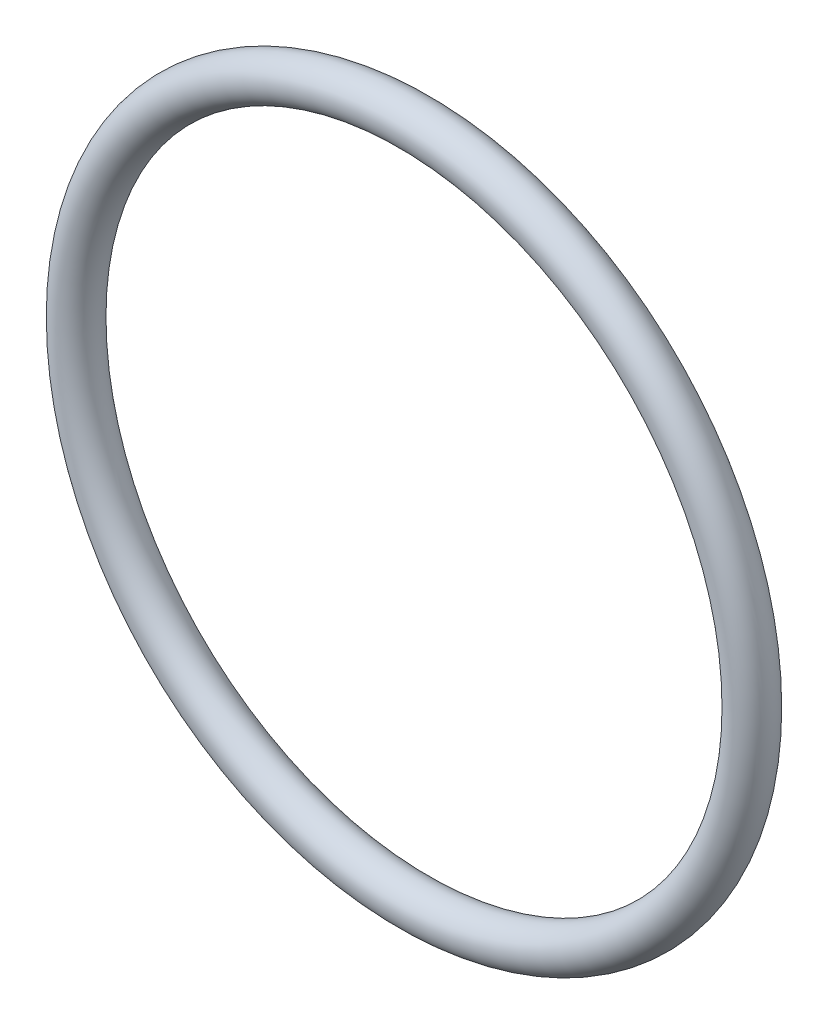
ISO-10303-21;
HEADER;
FILE_DESCRIPTION(('STEP AP214'),'2;1');
FILE_NAME('part.step','',(''),(''),'','','');
FILE_SCHEMA(('AUTOMOTIVE_DESIGN { 1 0 10303 214 1 1 1 1 }'));
ENDSEC;
DATA;
#1=APPLICATION_CONTEXT('core data for automotive mechanical design processes');
#2=APPLICATION_PROTOCOL_DEFINITION('international standard','automotive_design',2000,#1);
#3=PRODUCT_CONTEXT('',#1,'mechanical');
#4=PRODUCT('Part','Part','',(#3));
#5=PRODUCT_RELATED_PRODUCT_CATEGORY('part','',(#4));
#6=PRODUCT_DEFINITION_FORMATION('','',#4);
#7=PRODUCT_DEFINITION_CONTEXT('part definition',#1,'design');
#8=PRODUCT_DEFINITION('design','',#6,#7);
#9=PRODUCT_DEFINITION_SHAPE('','',#8);
#10=(LENGTH_UNIT() NAMED_UNIT(*) SI_UNIT(.MILLI.,.METRE.));
#11=(NAMED_UNIT(*) PLANE_ANGLE_UNIT() SI_UNIT($,.RADIAN.));
#12=(NAMED_UNIT(*) SI_UNIT($,.STERADIAN.) SOLID_ANGLE_UNIT());
#13=UNCERTAINTY_MEASURE_WITH_UNIT(LENGTH_MEASURE(1.E-05),#10,'distance_accuracy_value','');
#14=(GEOMETRIC_REPRESENTATION_CONTEXT(3) GLOBAL_UNCERTAINTY_ASSIGNED_CONTEXT((#13)) GLOBAL_UNIT_ASSIGNED_CONTEXT((#10,
#11,#12)) REPRESENTATION_CONTEXT('',''));
#15=CARTESIAN_POINT('',(0.,0.,0.));
#16=DIRECTION('',(0.,0.,1.));
#17=DIRECTION('',(1.,0.,0.));
#18=AXIS2_PLACEMENT_3D('',#15,#16,#17);
#19=CARTESIAN_POINT('',(0.,0.,0.));
#20=DIRECTION('',(0.,0.,1.));
#21=DIRECTION('',(1.,0.,0.));
#22=AXIS2_PLACEMENT_3D('',#19,#20,#21);
#23=TOROIDAL_SURFACE('',#22,40.,2.5);
#24=CARTESIAN_POINT('',(40.,0.,0.));
#25=DIRECTION('',(0.,1.,0.));
#26=DIRECTION('',(-1.,0.,0.));
#27=AXIS2_PLACEMENT_3D('',#24,#25,#26);
#28=CIRCLE('',#27,2.5);
#29=CARTESIAN_POINT('',(42.5,0.,0.));
#30=VERTEX_POINT('',#29);
#31=EDGE_CURVE('E11',#30,#30,#28,.T.);
#32=CARTESIAN_POINT('',(0.,0.,0.));
#33=DIRECTION('',(0.,0.,1.));
#34=DIRECTION('',(1.,0.,0.));
#35=AXIS2_PLACEMENT_3D('',#32,#33,#34);
#36=CIRCLE('',#35,42.5);
#37=EDGE_CURVE('',#30,#30,#36,.T.);
#38=ORIENTED_EDGE('',*,*,#31,.T.);
#39=ORIENTED_EDGE('',*,*,#31,.F.);
#40=ORIENTED_EDGE('',*,*,#37,.T.);
#41=ORIENTED_EDGE('',*,*,#37,.F.);
#42=EDGE_LOOP('',(#38,#40,#39,#41));
#43=FACE_BOUND('',#42,.T.);
#44=ADVANCED_FACE('F48',(#43),#23,.T.);
#45=CLOSED_SHELL('',(#44));
#46=MANIFOLD_SOLID_BREP('B2',#45);
#47=ADVANCED_BREP_SHAPE_REPRESENTATION('',(#18,#46),#14);
#48=SHAPE_DEFINITION_REPRESENTATION(#9,#47);
ENDSEC;
END-ISO-10303-21;
